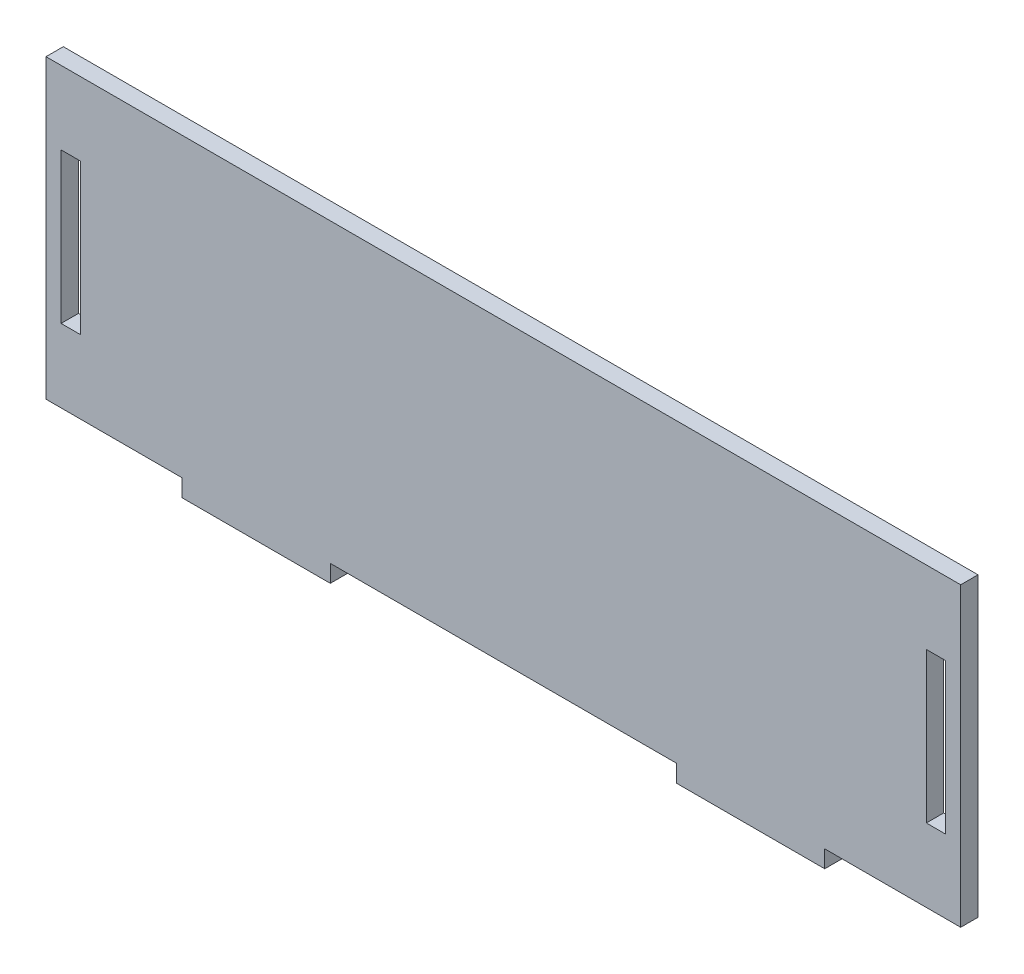
ISO-10303-21;
HEADER;
FILE_DESCRIPTION(('STEP AP214'),'2;1');
FILE_NAME('part.step','',(''),(''),'','','');
FILE_SCHEMA(('AUTOMOTIVE_DESIGN { 1 0 10303 214 1 1 1 1 }'));
ENDSEC;
DATA;
#1=APPLICATION_CONTEXT('core data for automotive mechanical design processes');
#2=APPLICATION_PROTOCOL_DEFINITION('international standard','automotive_design',2000,#1);
#3=PRODUCT_CONTEXT('',#1,'mechanical');
#4=PRODUCT('Part','Part','',(#3));
#5=PRODUCT_RELATED_PRODUCT_CATEGORY('part','',(#4));
#6=PRODUCT_DEFINITION_FORMATION('','',#4);
#7=PRODUCT_DEFINITION_CONTEXT('part definition',#1,'design');
#8=PRODUCT_DEFINITION('design','',#6,#7);
#9=PRODUCT_DEFINITION_SHAPE('','',#8);
#10=(LENGTH_UNIT() NAMED_UNIT(*) SI_UNIT(.MILLI.,.METRE.));
#11=(NAMED_UNIT(*) PLANE_ANGLE_UNIT() SI_UNIT($,.RADIAN.));
#12=(NAMED_UNIT(*) SI_UNIT($,.STERADIAN.) SOLID_ANGLE_UNIT());
#13=UNCERTAINTY_MEASURE_WITH_UNIT(LENGTH_MEASURE(1.E-05),#10,'distance_accuracy_value','');
#14=(GEOMETRIC_REPRESENTATION_CONTEXT(3) GLOBAL_UNCERTAINTY_ASSIGNED_CONTEXT((#13)) GLOBAL_UNIT_ASSIGNED_CONTEXT((#10,
#11,#12)) REPRESENTATION_CONTEXT('',''));
#15=CARTESIAN_POINT('',(0.,0.,0.));
#16=DIRECTION('',(0.,0.,1.));
#17=DIRECTION('',(1.,0.,0.));
#18=AXIS2_PLACEMENT_3D('',#15,#16,#17);
#19=CARTESIAN_POINT('',(0.,45.2,3.5));
#20=DIRECTION('',(0.,-1.,0.));
#21=DIRECTION('',(0.,0.,-1.));
#22=AXIS2_PLACEMENT_3D('',#19,#20,#21);
#23=PLANE('',#22);
#24=DIRECTION('',(-1.,0.,0.));
#25=VECTOR('',#24,1.);
#26=CARTESIAN_POINT('',(0.,45.2,0.));
#27=LINE('',#26,#25);
#28=CARTESIAN_POINT('',(181.95,45.2,0.));
#29=VERTEX_POINT('',#28);
#30=CARTESIAN_POINT('',(178.05,45.2,0.));
#31=VERTEX_POINT('',#30);
#32=EDGE_CURVE('E296',#29,#31,#27,.T.);
#33=ORIENTED_EDGE('',*,*,#32,.F.);
#34=DIRECTION('',(0.,0.,-1.));
#35=VECTOR('',#34,1.);
#36=CARTESIAN_POINT('',(181.95,45.2,3.5));
#37=LINE('',#36,#35);
#38=CARTESIAN_POINT('',(181.95,45.2,3.5));
#39=VERTEX_POINT('',#38);
#40=EDGE_CURVE('E11',#39,#29,#37,.T.);
#41=ORIENTED_EDGE('',*,*,#40,.F.);
#42=DIRECTION('',(-1.,0.,0.));
#43=VECTOR('',#42,1.);
#44=CARTESIAN_POINT('',(0.,45.2,3.5));
#45=LINE('',#44,#43);
#46=CARTESIAN_POINT('',(178.05,45.2,3.5));
#47=VERTEX_POINT('',#46);
#48=EDGE_CURVE('E195',#39,#47,#45,.T.);
#49=ORIENTED_EDGE('',*,*,#48,.T.);
#50=DIRECTION('',(0.,0.,-1.));
#51=VECTOR('',#50,1.);
#52=CARTESIAN_POINT('',(178.05,45.2,3.5));
#53=LINE('',#52,#51);
#54=EDGE_CURVE('E56',#47,#31,#53,.T.);
#55=ORIENTED_EDGE('',*,*,#54,.T.);
#56=EDGE_LOOP('',(#33,#41,#49,#55));
#57=FACE_BOUND('',#56,.T.);
#58=ADVANCED_FACE('F37',(#57),#23,.T.);
#59=CARTESIAN_POINT('',(181.95,0.,3.5));
#60=DIRECTION('',(1.,0.,0.));
#61=DIRECTION('',(0.,0.,-1.));
#62=AXIS2_PLACEMENT_3D('',#59,#60,#61);
#63=PLANE('',#62);
#64=DIRECTION('',(0.,-1.,0.));
#65=VECTOR('',#64,1.);
#66=CARTESIAN_POINT('',(181.95,0.,0.));
#67=LINE('',#66,#65);
#68=CARTESIAN_POINT('',(181.95,14.8,0.));
#69=VERTEX_POINT('',#68);
#70=EDGE_CURVE('E200',#29,#69,#67,.T.);
#71=ORIENTED_EDGE('',*,*,#70,.T.);
#72=DIRECTION('',(0.,0.,-1.));
#73=VECTOR('',#72,1.);
#74=CARTESIAN_POINT('',(181.95,14.8,3.5));
#75=LINE('',#74,#73);
#76=CARTESIAN_POINT('',(181.95,14.8,3.5));
#77=VERTEX_POINT('',#76);
#78=EDGE_CURVE('E47',#77,#69,#75,.T.);
#79=ORIENTED_EDGE('',*,*,#78,.F.);
#80=DIRECTION('',(0.,-1.,0.));
#81=VECTOR('',#80,1.);
#82=CARTESIAN_POINT('',(181.95,0.,3.5));
#83=LINE('',#82,#81);
#84=EDGE_CURVE('E190',#39,#77,#83,.T.);
#85=ORIENTED_EDGE('',*,*,#84,.F.);
#86=ORIENTED_EDGE('',*,*,#40,.T.);
#87=EDGE_LOOP('',(#71,#79,#85,#86));
#88=FACE_BOUND('',#87,.T.);
#89=ADVANCED_FACE('F198',(#88),#63,.F.);
#90=CARTESIAN_POINT('',(0.,14.8,3.5));
#91=DIRECTION('',(0.,-1.,0.));
#92=DIRECTION('',(0.,0.,-1.));
#93=AXIS2_PLACEMENT_3D('',#90,#91,#92);
#94=PLANE('',#93);
#95=DIRECTION('',(-1.,0.,0.));
#96=VECTOR('',#95,1.);
#97=CARTESIAN_POINT('',(0.,14.8,0.));
#98=LINE('',#97,#96);
#99=CARTESIAN_POINT('',(178.05,14.8,0.));
#100=VERTEX_POINT('',#99);
#101=EDGE_CURVE('E299',#69,#100,#98,.T.);
#102=ORIENTED_EDGE('',*,*,#101,.T.);
#103=DIRECTION('',(0.,0.,-1.));
#104=VECTOR('',#103,1.);
#105=CARTESIAN_POINT('',(178.05,14.8,3.5));
#106=LINE('',#105,#104);
#107=CARTESIAN_POINT('',(178.05,14.8,3.5));
#108=VERTEX_POINT('',#107);
#109=EDGE_CURVE('E118',#108,#100,#106,.T.);
#110=ORIENTED_EDGE('',*,*,#109,.F.);
#111=DIRECTION('',(-1.,0.,0.));
#112=VECTOR('',#111,1.);
#113=CARTESIAN_POINT('',(0.,14.8,3.5));
#114=LINE('',#113,#112);
#115=EDGE_CURVE('E182',#77,#108,#114,.T.);
#116=ORIENTED_EDGE('',*,*,#115,.F.);
#117=ORIENTED_EDGE('',*,*,#78,.T.);
#118=EDGE_LOOP('',(#102,#110,#116,#117));
#119=FACE_BOUND('',#118,.T.);
#120=ADVANCED_FACE('F184',(#119),#94,.F.);
#121=CARTESIAN_POINT('',(0.,45.2,3.5));
#122=DIRECTION('',(0.,1.,0.));
#123=DIRECTION('',(0.,0.,1.));
#124=AXIS2_PLACEMENT_3D('',#121,#122,#123);
#125=PLANE('',#124);
#126=DIRECTION('',(1.,0.,0.));
#127=VECTOR('',#126,1.);
#128=CARTESIAN_POINT('',(0.,45.2,0.));
#129=LINE('',#128,#127);
#130=CARTESIAN_POINT('',(3.05,45.2,0.));
#131=VERTEX_POINT('',#130);
#132=CARTESIAN_POINT('',(6.95,45.2,0.));
#133=VERTEX_POINT('',#132);
#134=EDGE_CURVE('E284',#131,#133,#129,.T.);
#135=ORIENTED_EDGE('',*,*,#134,.T.);
#136=DIRECTION('',(0.,0.,-1.));
#137=VECTOR('',#136,1.);
#138=CARTESIAN_POINT('',(6.95,45.2,3.5));
#139=LINE('',#138,#137);
#140=CARTESIAN_POINT('',(6.95,45.2,3.5));
#141=VERTEX_POINT('',#140);
#142=EDGE_CURVE('E211',#141,#133,#139,.T.);
#143=ORIENTED_EDGE('',*,*,#142,.F.);
#144=DIRECTION('',(1.,0.,0.));
#145=VECTOR('',#144,1.);
#146=CARTESIAN_POINT('',(0.,45.2,3.5));
#147=LINE('',#146,#145);
#148=CARTESIAN_POINT('',(3.05,45.2,3.5));
#149=VERTEX_POINT('',#148);
#150=EDGE_CURVE('E336',#149,#141,#147,.T.);
#151=ORIENTED_EDGE('',*,*,#150,.F.);
#152=DIRECTION('',(0.,0.,-1.));
#153=VECTOR('',#152,1.);
#154=CARTESIAN_POINT('',(3.05,45.2,3.5));
#155=LINE('',#154,#153);
#156=EDGE_CURVE('E205',#149,#131,#155,.T.);
#157=ORIENTED_EDGE('',*,*,#156,.T.);
#158=EDGE_LOOP('',(#135,#143,#151,#157));
#159=FACE_BOUND('',#158,.T.);
#160=ADVANCED_FACE('F380',(#159),#125,.F.);
#161=CARTESIAN_POINT('',(6.95,0.,3.5));
#162=DIRECTION('',(1.,0.,0.));
#163=DIRECTION('',(0.,1.,0.));
#164=AXIS2_PLACEMENT_3D('',#161,#162,#163);
#165=PLANE('',#164);
#166=DIRECTION('',(0.,-1.,0.));
#167=VECTOR('',#166,1.);
#168=CARTESIAN_POINT('',(6.95,0.,0.));
#169=LINE('',#168,#167);
#170=CARTESIAN_POINT('',(6.95,14.8,0.));
#171=VERTEX_POINT('',#170);
#172=EDGE_CURVE('E287',#133,#171,#169,.T.);
#173=ORIENTED_EDGE('',*,*,#172,.T.);
#174=DIRECTION('',(0.,0.,-1.));
#175=VECTOR('',#174,1.);
#176=CARTESIAN_POINT('',(6.95,14.8,3.5));
#177=LINE('',#176,#175);
#178=CARTESIAN_POINT('',(6.95,14.8,3.5));
#179=VERTEX_POINT('',#178);
#180=EDGE_CURVE('E209',#179,#171,#177,.T.);
#181=ORIENTED_EDGE('',*,*,#180,.F.);
#182=DIRECTION('',(0.,-1.,0.));
#183=VECTOR('',#182,1.);
#184=CARTESIAN_POINT('',(6.95,0.,3.5));
#185=LINE('',#184,#183);
#186=EDGE_CURVE('E339',#141,#179,#185,.T.);
#187=ORIENTED_EDGE('',*,*,#186,.F.);
#188=ORIENTED_EDGE('',*,*,#142,.T.);
#189=EDGE_LOOP('',(#173,#181,#187,#188));
#190=FACE_BOUND('',#189,.T.);
#191=ADVANCED_FACE('F376',(#190),#165,.F.);
#192=CARTESIAN_POINT('',(0.,14.8,3.5));
#193=DIRECTION('',(0.,1.,0.));
#194=DIRECTION('',(0.,0.,1.));
#195=AXIS2_PLACEMENT_3D('',#192,#193,#194);
#196=PLANE('',#195);
#197=DIRECTION('',(1.,0.,0.));
#198=VECTOR('',#197,1.);
#199=CARTESIAN_POINT('',(0.,14.8,0.));
#200=LINE('',#199,#198);
#201=CARTESIAN_POINT('',(3.05,14.8,0.));
#202=VERTEX_POINT('',#201);
#203=EDGE_CURVE('E290',#202,#171,#200,.T.);
#204=ORIENTED_EDGE('',*,*,#203,.F.);
#205=DIRECTION('',(0.,0.,-1.));
#206=VECTOR('',#205,1.);
#207=CARTESIAN_POINT('',(3.05,14.8,3.5));
#208=LINE('',#207,#206);
#209=CARTESIAN_POINT('',(3.05,14.8,3.5));
#210=VERTEX_POINT('',#209);
#211=EDGE_CURVE('E207',#210,#202,#208,.T.);
#212=ORIENTED_EDGE('',*,*,#211,.F.);
#213=DIRECTION('',(1.,0.,0.));
#214=VECTOR('',#213,1.);
#215=CARTESIAN_POINT('',(0.,14.8,3.5));
#216=LINE('',#215,#214);
#217=EDGE_CURVE('E341',#210,#179,#216,.T.);
#218=ORIENTED_EDGE('',*,*,#217,.T.);
#219=ORIENTED_EDGE('',*,*,#180,.T.);
#220=EDGE_LOOP('',(#204,#212,#218,#219));
#221=FACE_BOUND('',#220,.T.);
#222=ADVANCED_FACE('F373',(#221),#196,.T.);
#223=CARTESIAN_POINT('',(0.,0.,3.5));
#224=DIRECTION('',(0.,1.,0.));
#225=DIRECTION('',(0.,0.,1.));
#226=AXIS2_PLACEMENT_3D('',#223,#224,#225);
#227=PLANE('',#226);
#228=DIRECTION('',(1.,0.,0.));
#229=VECTOR('',#228,1.);
#230=CARTESIAN_POINT('',(0.,0.,0.));
#231=LINE('',#230,#229);
#232=CARTESIAN_POINT('',(0.,0.,0.));
#233=VERTEX_POINT('',#232);
#234=CARTESIAN_POINT('',(27.5,0.,0.));
#235=VERTEX_POINT('',#234);
#236=EDGE_CURVE('E247',#233,#235,#231,.T.);
#237=ORIENTED_EDGE('',*,*,#236,.T.);
#238=DIRECTION('',(0.,0.,-1.));
#239=VECTOR('',#238,1.);
#240=CARTESIAN_POINT('',(27.5,0.,3.5));
#241=LINE('',#240,#239);
#242=CARTESIAN_POINT('',(27.5,0.,3.5));
#243=VERTEX_POINT('',#242);
#244=EDGE_CURVE('E41',#243,#235,#241,.T.);
#245=ORIENTED_EDGE('',*,*,#244,.F.);
#246=DIRECTION('',(1.,0.,0.));
#247=VECTOR('',#246,1.);
#248=CARTESIAN_POINT('',(0.,0.,3.5));
#249=LINE('',#248,#247);
#250=CARTESIAN_POINT('',(0.,0.,3.5));
#251=VERTEX_POINT('',#250);
#252=EDGE_CURVE('E303',#251,#243,#249,.T.);
#253=ORIENTED_EDGE('',*,*,#252,.F.);
#254=DIRECTION('',(0.,0.,-1.));
#255=VECTOR('',#254,1.);
#256=CARTESIAN_POINT('',(0.,0.,3.5));
#257=LINE('',#256,#255);
#258=EDGE_CURVE('E214',#251,#233,#257,.T.);
#259=ORIENTED_EDGE('',*,*,#258,.T.);
#260=EDGE_LOOP('',(#237,#245,#253,#259));
#261=FACE_BOUND('',#260,.T.);
#262=ADVANCED_FACE('F248',(#261),#227,.F.);
#263=CARTESIAN_POINT('',(27.5,0.,3.5));
#264=DIRECTION('',(1.,0.,0.));
#265=DIRECTION('',(0.,0.,-1.));
#266=AXIS2_PLACEMENT_3D('',#263,#264,#265);
#267=PLANE('',#266);
#268=DIRECTION('',(0.,-1.,0.));
#269=VECTOR('',#268,1.);
#270=CARTESIAN_POINT('',(27.5,0.,0.));
#271=LINE('',#270,#269);
#272=CARTESIAN_POINT('',(27.5,-3.5,0.));
#273=VERTEX_POINT('',#272);
#274=EDGE_CURVE('E243',#235,#273,#271,.T.);
#275=ORIENTED_EDGE('',*,*,#274,.T.);
#276=DIRECTION('',(0.,0.,-1.));
#277=VECTOR('',#276,1.);
#278=CARTESIAN_POINT('',(27.5,-3.5,3.5));
#279=LINE('',#278,#277);
#280=CARTESIAN_POINT('',(27.5,-3.5,3.5));
#281=VERTEX_POINT('',#280);
#282=EDGE_CURVE('E235',#281,#273,#279,.T.);
#283=ORIENTED_EDGE('',*,*,#282,.F.);
#284=DIRECTION('',(0.,-1.,0.));
#285=VECTOR('',#284,1.);
#286=CARTESIAN_POINT('',(27.5,0.,3.5));
#287=LINE('',#286,#285);
#288=EDGE_CURVE('E131',#243,#281,#287,.T.);
#289=ORIENTED_EDGE('',*,*,#288,.F.);
#290=ORIENTED_EDGE('',*,*,#244,.T.);
#291=EDGE_LOOP('',(#275,#283,#289,#290));
#292=FACE_BOUND('',#291,.T.);
#293=ADVANCED_FACE('F39',(#292),#267,.F.);
#294=CARTESIAN_POINT('',(0.,-3.5,3.5));
#295=DIRECTION('',(0.,1.,0.));
#296=DIRECTION('',(0.,0.,1.));
#297=AXIS2_PLACEMENT_3D('',#294,#295,#296);
#298=PLANE('',#297);
#299=DIRECTION('',(1.,0.,0.));
#300=VECTOR('',#299,1.);
#301=CARTESIAN_POINT('',(0.,-3.5,0.));
#302=LINE('',#301,#300);
#303=CARTESIAN_POINT('',(57.5,-3.5,0.));
#304=VERTEX_POINT('',#303);
#305=EDGE_CURVE('E255',#273,#304,#302,.T.);
#306=ORIENTED_EDGE('',*,*,#305,.T.);
#307=DIRECTION('',(0.,0.,-1.));
#308=VECTOR('',#307,1.);
#309=CARTESIAN_POINT('',(57.5,-3.5,3.5));
#310=LINE('',#309,#308);
#311=CARTESIAN_POINT('',(57.5,-3.5,3.5));
#312=VERTEX_POINT('',#311);
#313=EDGE_CURVE('E234',#312,#304,#310,.T.);
#314=ORIENTED_EDGE('',*,*,#313,.F.);
#315=DIRECTION('',(1.,0.,0.));
#316=VECTOR('',#315,1.);
#317=CARTESIAN_POINT('',(0.,-3.5,3.5));
#318=LINE('',#317,#316);
#319=EDGE_CURVE('E310',#281,#312,#318,.T.);
#320=ORIENTED_EDGE('',*,*,#319,.F.);
#321=ORIENTED_EDGE('',*,*,#282,.T.);
#322=EDGE_LOOP('',(#306,#314,#320,#321));
#323=FACE_BOUND('',#322,.T.);
#324=ADVANCED_FACE('F411',(#323),#298,.F.);
#325=CARTESIAN_POINT('',(57.5,0.,3.5));
#326=DIRECTION('',(1.,0.,0.));
#327=DIRECTION('',(0.,0.,-1.));
#328=AXIS2_PLACEMENT_3D('',#325,#326,#327);
#329=PLANE('',#328);
#330=DIRECTION('',(0.,-1.,0.));
#331=VECTOR('',#330,1.);
#332=CARTESIAN_POINT('',(57.5,0.,0.));
#333=LINE('',#332,#331);
#334=CARTESIAN_POINT('',(57.5,0.,0.));
#335=VERTEX_POINT('',#334);
#336=EDGE_CURVE('E261',#335,#304,#333,.T.);
#337=ORIENTED_EDGE('',*,*,#336,.F.);
#338=DIRECTION('',(0.,0.,-1.));
#339=VECTOR('',#338,1.);
#340=CARTESIAN_POINT('',(57.5,0.,3.5));
#341=LINE('',#340,#339);
#342=CARTESIAN_POINT('',(57.5,0.,3.5));
#343=VERTEX_POINT('',#342);
#344=EDGE_CURVE('E232',#343,#335,#341,.T.);
#345=ORIENTED_EDGE('',*,*,#344,.F.);
#346=DIRECTION('',(0.,-1.,0.));
#347=VECTOR('',#346,1.);
#348=CARTESIAN_POINT('',(57.5,0.,3.5));
#349=LINE('',#348,#347);
#350=EDGE_CURVE('E315',#343,#312,#349,.T.);
#351=ORIENTED_EDGE('',*,*,#350,.T.);
#352=ORIENTED_EDGE('',*,*,#313,.T.);
#353=EDGE_LOOP('',(#337,#345,#351,#352));
#354=FACE_BOUND('',#353,.T.);
#355=ADVANCED_FACE('F409',(#354),#329,.T.);
#356=CARTESIAN_POINT('',(127.5,0.,0.));
#357=VERTEX_POINT('',#356);
#358=EDGE_CURVE('E254',#335,#357,#231,.T.);
#359=ORIENTED_EDGE('',*,*,#358,.T.);
#360=DIRECTION('',(0.,0.,-1.));
#361=VECTOR('',#360,1.);
#362=CARTESIAN_POINT('',(127.5,0.,3.5));
#363=LINE('',#362,#361);
#364=CARTESIAN_POINT('',(127.5,0.,3.5));
#365=VERTEX_POINT('',#364);
#366=EDGE_CURVE('E229',#365,#357,#363,.T.);
#367=ORIENTED_EDGE('',*,*,#366,.F.);
#368=EDGE_CURVE('E307',#343,#365,#249,.T.);
#369=ORIENTED_EDGE('',*,*,#368,.F.);
#370=ORIENTED_EDGE('',*,*,#344,.T.);
#371=EDGE_LOOP('',(#359,#367,#369,#370));
#372=FACE_BOUND('',#371,.T.);
#373=ADVANCED_FACE('F397',(#372),#227,.F.);
#374=CARTESIAN_POINT('',(127.5,0.,3.5));
#375=DIRECTION('',(1.,0.,0.));
#376=DIRECTION('',(0.,0.,-1.));
#377=AXIS2_PLACEMENT_3D('',#374,#375,#376);
#378=PLANE('',#377);
#379=DIRECTION('',(0.,-1.,0.));
#380=VECTOR('',#379,1.);
#381=CARTESIAN_POINT('',(127.5,0.,0.));
#382=LINE('',#381,#380);
#383=CARTESIAN_POINT('',(127.5,-3.5,0.));
#384=VERTEX_POINT('',#383);
#385=EDGE_CURVE('E260',#357,#384,#382,.T.);
#386=ORIENTED_EDGE('',*,*,#385,.T.);
#387=DIRECTION('',(0.,0.,-1.));
#388=VECTOR('',#387,1.);
#389=CARTESIAN_POINT('',(127.5,-3.5,3.5));
#390=LINE('',#389,#388);
#391=CARTESIAN_POINT('',(127.5,-3.5,3.5));
#392=VERTEX_POINT('',#391);
#393=EDGE_CURVE('E227',#392,#384,#390,.T.);
#394=ORIENTED_EDGE('',*,*,#393,.F.);
#395=DIRECTION('',(0.,-1.,0.));
#396=VECTOR('',#395,1.);
#397=CARTESIAN_POINT('',(127.5,0.,3.5));
#398=LINE('',#397,#396);
#399=EDGE_CURVE('E314',#365,#392,#398,.T.);
#400=ORIENTED_EDGE('',*,*,#399,.F.);
#401=ORIENTED_EDGE('',*,*,#366,.T.);
#402=EDGE_LOOP('',(#386,#394,#400,#401));
#403=FACE_BOUND('',#402,.T.);
#404=ADVANCED_FACE('F404',(#403),#378,.F.);
#405=CARTESIAN_POINT('',(0.,-3.5,3.5));
#406=DIRECTION('',(0.,-1.,0.));
#407=DIRECTION('',(0.,0.,-1.));
#408=AXIS2_PLACEMENT_3D('',#405,#406,#407);
#409=PLANE('',#408);
#410=DIRECTION('',(-1.,0.,0.));
#411=VECTOR('',#410,1.);
#412=CARTESIAN_POINT('',(0.,-3.5,0.));
#413=LINE('',#412,#411);
#414=CARTESIAN_POINT('',(157.5,-3.5,0.));
#415=VERTEX_POINT('',#414);
#416=EDGE_CURVE('E266',#415,#384,#413,.T.);
#417=ORIENTED_EDGE('',*,*,#416,.F.);
#418=DIRECTION('',(0.,0.,-1.));
#419=VECTOR('',#418,1.);
#420=CARTESIAN_POINT('',(157.5,-3.5,3.5));
#421=LINE('',#420,#419);
#422=CARTESIAN_POINT('',(157.5,-3.5,3.5));
#423=VERTEX_POINT('',#422);
#424=EDGE_CURVE('E225',#423,#415,#421,.T.);
#425=ORIENTED_EDGE('',*,*,#424,.F.);
#426=DIRECTION('',(-1.,0.,0.));
#427=VECTOR('',#426,1.);
#428=CARTESIAN_POINT('',(0.,-3.5,3.5));
#429=LINE('',#428,#427);
#430=EDGE_CURVE('E318',#423,#392,#429,.T.);
#431=ORIENTED_EDGE('',*,*,#430,.T.);
#432=ORIENTED_EDGE('',*,*,#393,.T.);
#433=EDGE_LOOP('',(#417,#425,#431,#432));
#434=FACE_BOUND('',#433,.T.);
#435=ADVANCED_FACE('F400',(#434),#409,.T.);
#436=CARTESIAN_POINT('',(157.5,0.,3.5));
#437=DIRECTION('',(1.,0.,0.));
#438=DIRECTION('',(0.,0.,-1.));
#439=AXIS2_PLACEMENT_3D('',#436,#437,#438);
#440=PLANE('',#439);
#441=DIRECTION('',(0.,-1.,0.));
#442=VECTOR('',#441,1.);
#443=CARTESIAN_POINT('',(157.5,0.,0.));
#444=LINE('',#443,#442);
#445=CARTESIAN_POINT('',(157.5,0.,0.));
#446=VERTEX_POINT('',#445);
#447=EDGE_CURVE('E259',#446,#415,#444,.T.);
#448=ORIENTED_EDGE('',*,*,#447,.F.);
#449=DIRECTION('',(0.,0.,-1.));
#450=VECTOR('',#449,1.);
#451=CARTESIAN_POINT('',(157.5,0.,3.5));
#452=LINE('',#451,#450);
#453=CARTESIAN_POINT('',(157.5,0.,3.5));
#454=VERTEX_POINT('',#453);
#455=EDGE_CURVE('E223',#454,#446,#452,.T.);
#456=ORIENTED_EDGE('',*,*,#455,.F.);
#457=DIRECTION('',(0.,-1.,0.));
#458=VECTOR('',#457,1.);
#459=CARTESIAN_POINT('',(157.5,0.,3.5));
#460=LINE('',#459,#458);
#461=EDGE_CURVE('E313',#454,#423,#460,.T.);
#462=ORIENTED_EDGE('',*,*,#461,.T.);
#463=ORIENTED_EDGE('',*,*,#424,.T.);
#464=EDGE_LOOP('',(#448,#456,#462,#463));
#465=FACE_BOUND('',#464,.T.);
#466=ADVANCED_FACE('F395',(#465),#440,.T.);
#467=CARTESIAN_POINT('',(185.,0.,0.));
#468=VERTEX_POINT('',#467);
#469=EDGE_CURVE('E253',#446,#468,#231,.T.);
#470=ORIENTED_EDGE('',*,*,#469,.T.);
#471=DIRECTION('',(0.,0.,-1.));
#472=VECTOR('',#471,1.);
#473=CARTESIAN_POINT('',(185.,0.,3.5));
#474=LINE('',#473,#472);
#475=CARTESIAN_POINT('',(185.,0.,3.5));
#476=VERTEX_POINT('',#475);
#477=EDGE_CURVE('E220',#476,#468,#474,.T.);
#478=ORIENTED_EDGE('',*,*,#477,.F.);
#479=EDGE_CURVE('E306',#454,#476,#249,.T.);
#480=ORIENTED_EDGE('',*,*,#479,.F.);
#481=ORIENTED_EDGE('',*,*,#455,.T.);
#482=EDGE_LOOP('',(#470,#478,#480,#481));
#483=FACE_BOUND('',#482,.T.);
#484=ADVANCED_FACE('F391',(#483),#227,.F.);
#485=CARTESIAN_POINT('',(185.,0.,3.5));
#486=DIRECTION('',(-1.,0.,0.));
#487=DIRECTION('',(0.,0.,1.));
#488=AXIS2_PLACEMENT_3D('',#485,#486,#487);
#489=PLANE('',#488);
#490=DIRECTION('',(0.,1.,0.));
#491=VECTOR('',#490,1.);
#492=CARTESIAN_POINT('',(185.,0.,0.));
#493=LINE('',#492,#491);
#494=CARTESIAN_POINT('',(185.,60.,0.));
#495=VERTEX_POINT('',#494);
#496=EDGE_CURVE('E258',#468,#495,#493,.T.);
#497=ORIENTED_EDGE('',*,*,#496,.T.);
#498=DIRECTION('',(0.,0.,-1.));
#499=VECTOR('',#498,1.);
#500=CARTESIAN_POINT('',(185.,60.,3.5));
#501=LINE('',#500,#499);
#502=CARTESIAN_POINT('',(185.,60.,3.5));
#503=VERTEX_POINT('',#502);
#504=EDGE_CURVE('E218',#503,#495,#501,.T.);
#505=ORIENTED_EDGE('',*,*,#504,.F.);
#506=DIRECTION('',(0.,1.,0.));
#507=VECTOR('',#506,1.);
#508=CARTESIAN_POINT('',(185.,0.,3.5));
#509=LINE('',#508,#507);
#510=EDGE_CURVE('E312',#476,#503,#509,.T.);
#511=ORIENTED_EDGE('',*,*,#510,.F.);
#512=ORIENTED_EDGE('',*,*,#477,.T.);
#513=EDGE_LOOP('',(#497,#505,#511,#512));
#514=FACE_BOUND('',#513,.T.);
#515=ADVANCED_FACE('F387',(#514),#489,.F.);
#516=CARTESIAN_POINT('',(0.,60.,3.5));
#517=DIRECTION('',(0.,1.,0.));
#518=DIRECTION('',(0.,0.,1.));
#519=AXIS2_PLACEMENT_3D('',#516,#517,#518);
#520=PLANE('',#519);
#521=DIRECTION('',(1.,0.,0.));
#522=VECTOR('',#521,1.);
#523=CARTESIAN_POINT('',(0.,60.,0.));
#524=LINE('',#523,#522);
#525=CARTESIAN_POINT('',(0.,60.,0.));
#526=VERTEX_POINT('',#525);
#527=EDGE_CURVE('E279',#526,#495,#524,.T.);
#528=ORIENTED_EDGE('',*,*,#527,.F.);
#529=DIRECTION('',(0.,0.,-1.));
#530=VECTOR('',#529,1.);
#531=CARTESIAN_POINT('',(0.,60.,3.5));
#532=LINE('',#531,#530);
#533=CARTESIAN_POINT('',(0.,60.,3.5));
#534=VERTEX_POINT('',#533);
#535=EDGE_CURVE('E216',#534,#526,#532,.T.);
#536=ORIENTED_EDGE('',*,*,#535,.F.);
#537=DIRECTION('',(1.,0.,0.));
#538=VECTOR('',#537,1.);
#539=CARTESIAN_POINT('',(0.,60.,3.5));
#540=LINE('',#539,#538);
#541=EDGE_CURVE('E330',#534,#503,#540,.T.);
#542=ORIENTED_EDGE('',*,*,#541,.T.);
#543=ORIENTED_EDGE('',*,*,#504,.T.);
#544=EDGE_LOOP('',(#528,#536,#542,#543));
#545=FACE_BOUND('',#544,.T.);
#546=ADVANCED_FACE('F371',(#545),#520,.T.);
#547=CARTESIAN_POINT('',(3.05,0.,3.5));
#548=DIRECTION('',(1.,0.,0.));
#549=DIRECTION('',(0.,1.,0.));
#550=AXIS2_PLACEMENT_3D('',#547,#548,#549);
#551=PLANE('',#550);
#552=DIRECTION('',(0.,-1.,0.));
#553=VECTOR('',#552,1.);
#554=CARTESIAN_POINT('',(3.05,0.,0.));
#555=LINE('',#554,#553);
#556=EDGE_CURVE('E293',#131,#202,#555,.T.);
#557=ORIENTED_EDGE('',*,*,#556,.F.);
#558=ORIENTED_EDGE('',*,*,#156,.F.);
#559=DIRECTION('',(0.,-1.,0.));
#560=VECTOR('',#559,1.);
#561=CARTESIAN_POINT('',(3.05,0.,3.5));
#562=LINE('',#561,#560);
#563=EDGE_CURVE('E344',#149,#210,#562,.T.);
#564=ORIENTED_EDGE('',*,*,#563,.T.);
#565=ORIENTED_EDGE('',*,*,#211,.T.);
#566=EDGE_LOOP('',(#557,#558,#564,#565));
#567=FACE_BOUND('',#566,.T.);
#568=ADVANCED_FACE('F357',(#567),#551,.T.);
#569=CARTESIAN_POINT('',(0.,0.,3.5));
#570=DIRECTION('',(-1.,0.,0.));
#571=DIRECTION('',(0.,0.,1.));
#572=AXIS2_PLACEMENT_3D('',#569,#570,#571);
#573=PLANE('',#572);
#574=DIRECTION('',(0.,1.,0.));
#575=VECTOR('',#574,1.);
#576=CARTESIAN_POINT('',(0.,0.,0.));
#577=LINE('',#576,#575);
#578=EDGE_CURVE('E282',#233,#526,#577,.T.);
#579=ORIENTED_EDGE('',*,*,#578,.F.);
#580=ORIENTED_EDGE('',*,*,#258,.F.);
#581=DIRECTION('',(0.,1.,0.));
#582=VECTOR('',#581,1.);
#583=CARTESIAN_POINT('',(0.,0.,3.5));
#584=LINE('',#583,#582);
#585=EDGE_CURVE('E333',#251,#534,#584,.T.);
#586=ORIENTED_EDGE('',*,*,#585,.T.);
#587=ORIENTED_EDGE('',*,*,#535,.T.);
#588=EDGE_LOOP('',(#579,#580,#586,#587));
#589=FACE_BOUND('',#588,.T.);
#590=ADVANCED_FACE('F349',(#589),#573,.T.);
#591=CARTESIAN_POINT('',(178.05,1.62561849946142E-13,3.5));
#592=DIRECTION('',(1.,0.,0.));
#593=DIRECTION('',(0.,1.,0.));
#594=AXIS2_PLACEMENT_3D('',#591,#592,#593);
#595=PLANE('',#594);
#596=DIRECTION('',(0.,-1.,0.));
#597=VECTOR('',#596,1.);
#598=CARTESIAN_POINT('',(178.05,1.62561849946142E-13,0.));
#599=LINE('',#598,#597);
#600=EDGE_CURVE('E301',#31,#100,#599,.T.);
#601=ORIENTED_EDGE('',*,*,#600,.F.);
#602=ORIENTED_EDGE('',*,*,#54,.F.);
#603=DIRECTION('',(0.,-1.,0.));
#604=VECTOR('',#603,1.);
#605=CARTESIAN_POINT('',(178.05,1.62561849946142E-13,3.5));
#606=LINE('',#605,#604);
#607=EDGE_CURVE('E189',#47,#108,#606,.T.);
#608=ORIENTED_EDGE('',*,*,#607,.T.);
#609=ORIENTED_EDGE('',*,*,#109,.T.);
#610=EDGE_LOOP('',(#601,#602,#608,#609));
#611=FACE_BOUND('',#610,.T.);
#612=ADVANCED_FACE('F347',(#611),#595,.T.);
#613=CARTESIAN_POINT('',(0.,0.,3.5));
#614=DIRECTION('',(0.,0.,1.));
#615=DIRECTION('',(1.,0.,0.));
#616=AXIS2_PLACEMENT_3D('',#613,#614,#615);
#617=PLANE('',#616);
#618=ORIENTED_EDGE('',*,*,#252,.T.);
#619=ORIENTED_EDGE('',*,*,#288,.T.);
#620=ORIENTED_EDGE('',*,*,#319,.T.);
#621=ORIENTED_EDGE('',*,*,#350,.F.);
#622=ORIENTED_EDGE('',*,*,#368,.T.);
#623=ORIENTED_EDGE('',*,*,#399,.T.);
#624=ORIENTED_EDGE('',*,*,#430,.F.);
#625=ORIENTED_EDGE('',*,*,#461,.F.);
#626=ORIENTED_EDGE('',*,*,#479,.T.);
#627=ORIENTED_EDGE('',*,*,#510,.T.);
#628=ORIENTED_EDGE('',*,*,#541,.F.);
#629=ORIENTED_EDGE('',*,*,#585,.F.);
#630=EDGE_LOOP('',(#618,#619,#620,#621,#622,#623,#624,#625,#626,#627,#628,#629));
#631=FACE_BOUND('',#630,.T.);
#632=ORIENTED_EDGE('',*,*,#150,.T.);
#633=ORIENTED_EDGE('',*,*,#186,.T.);
#634=ORIENTED_EDGE('',*,*,#217,.F.);
#635=ORIENTED_EDGE('',*,*,#563,.F.);
#636=EDGE_LOOP('',(#632,#633,#634,#635));
#637=FACE_BOUND('',#636,.T.);
#638=ORIENTED_EDGE('',*,*,#48,.F.);
#639=ORIENTED_EDGE('',*,*,#84,.T.);
#640=ORIENTED_EDGE('',*,*,#115,.T.);
#641=ORIENTED_EDGE('',*,*,#607,.F.);
#642=EDGE_LOOP('',(#638,#639,#640,#641));
#643=FACE_BOUND('',#642,.T.);
#644=ADVANCED_FACE('F194',(#631,#637,#643),#617,.T.);
#645=CARTESIAN_POINT('',(0.,0.,0.));
#646=DIRECTION('',(0.,0.,1.));
#647=DIRECTION('',(1.,0.,0.));
#648=AXIS2_PLACEMENT_3D('',#645,#646,#647);
#649=PLANE('',#648);
#650=ORIENTED_EDGE('',*,*,#236,.F.);
#651=ORIENTED_EDGE('',*,*,#578,.T.);
#652=ORIENTED_EDGE('',*,*,#527,.T.);
#653=ORIENTED_EDGE('',*,*,#496,.F.);
#654=ORIENTED_EDGE('',*,*,#469,.F.);
#655=ORIENTED_EDGE('',*,*,#447,.T.);
#656=ORIENTED_EDGE('',*,*,#416,.T.);
#657=ORIENTED_EDGE('',*,*,#385,.F.);
#658=ORIENTED_EDGE('',*,*,#358,.F.);
#659=ORIENTED_EDGE('',*,*,#336,.T.);
#660=ORIENTED_EDGE('',*,*,#305,.F.);
#661=ORIENTED_EDGE('',*,*,#274,.F.);
#662=EDGE_LOOP('',(#650,#651,#652,#653,#654,#655,#656,#657,#658,#659,#660,#661));
#663=FACE_BOUND('',#662,.T.);
#664=ORIENTED_EDGE('',*,*,#134,.F.);
#665=ORIENTED_EDGE('',*,*,#556,.T.);
#666=ORIENTED_EDGE('',*,*,#203,.T.);
#667=ORIENTED_EDGE('',*,*,#172,.F.);
#668=EDGE_LOOP('',(#664,#665,#666,#667));
#669=FACE_BOUND('',#668,.T.);
#670=ORIENTED_EDGE('',*,*,#32,.T.);
#671=ORIENTED_EDGE('',*,*,#600,.T.);
#672=ORIENTED_EDGE('',*,*,#101,.F.);
#673=ORIENTED_EDGE('',*,*,#70,.F.);
#674=EDGE_LOOP('',(#670,#671,#672,#673));
#675=FACE_BOUND('',#674,.T.);
#676=ADVANCED_FACE('F355',(#663,#669,#675),#649,.F.);
#677=CLOSED_SHELL('',(#58,#89,#120,#160,#191,#222,#262,#293,#324,#355,#373,#404,#435,#466,#484,
#515,#546,#568,#590,#612,#644,#676));
#678=MANIFOLD_SOLID_BREP('B2',#677);
#679=ADVANCED_BREP_SHAPE_REPRESENTATION('',(#18,#678),#14);
#680=SHAPE_DEFINITION_REPRESENTATION(#9,#679);
ENDSEC;
END-ISO-10303-21;
